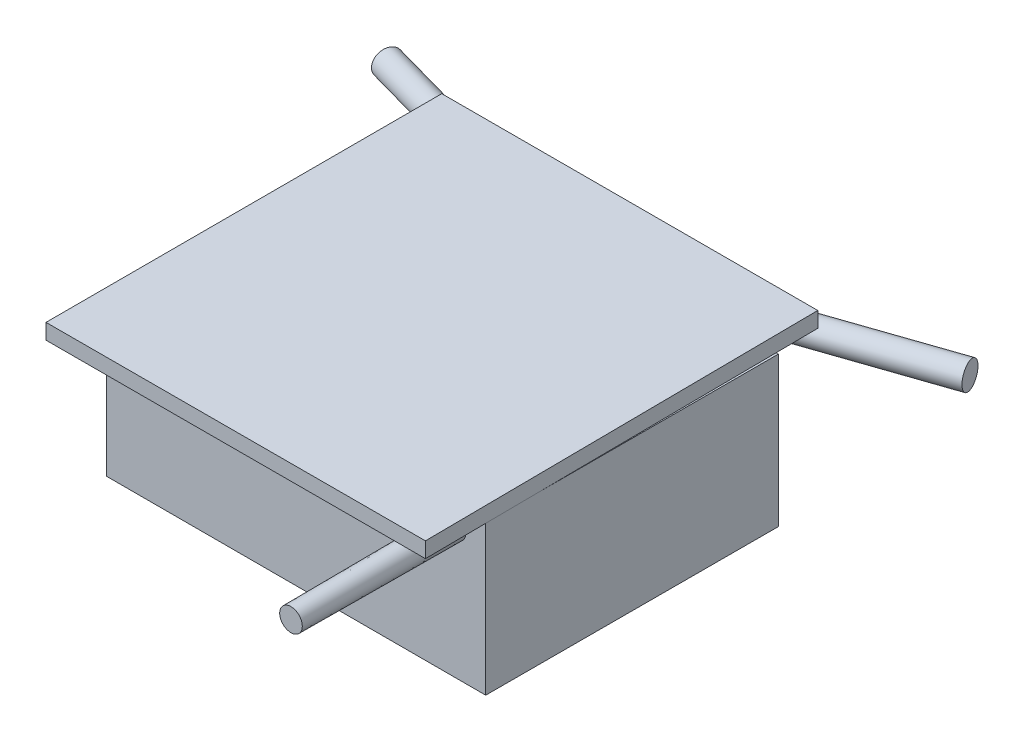
ISO-10303-21;
HEADER;
FILE_DESCRIPTION(('STEP AP214'),'2;1');
FILE_NAME('part.step','',(''),(''),'','','');
FILE_SCHEMA(('AUTOMOTIVE_DESIGN { 1 0 10303 214 1 1 1 1 }'));
ENDSEC;
DATA;
#1=APPLICATION_CONTEXT('core data for automotive mechanical design processes');
#2=APPLICATION_PROTOCOL_DEFINITION('international standard','automotive_design',2000,#1);
#3=PRODUCT_CONTEXT('',#1,'mechanical');
#4=PRODUCT('Part','Part','',(#3));
#5=PRODUCT_RELATED_PRODUCT_CATEGORY('part','',(#4));
#6=PRODUCT_DEFINITION_FORMATION('','',#4);
#7=PRODUCT_DEFINITION_CONTEXT('part definition',#1,'design');
#8=PRODUCT_DEFINITION('design','',#6,#7);
#9=PRODUCT_DEFINITION_SHAPE('','',#8);
#10=(LENGTH_UNIT() NAMED_UNIT(*) SI_UNIT(.MILLI.,.METRE.));
#11=(NAMED_UNIT(*) PLANE_ANGLE_UNIT() SI_UNIT($,.RADIAN.));
#12=(NAMED_UNIT(*) SI_UNIT($,.STERADIAN.) SOLID_ANGLE_UNIT());
#13=UNCERTAINTY_MEASURE_WITH_UNIT(LENGTH_MEASURE(1.E-05),#10,'distance_accuracy_value','');
#14=(GEOMETRIC_REPRESENTATION_CONTEXT(3) GLOBAL_UNCERTAINTY_ASSIGNED_CONTEXT((#13)) GLOBAL_UNIT_ASSIGNED_CONTEXT((#10,
#11,#12)) REPRESENTATION_CONTEXT('',''));
#15=CARTESIAN_POINT('',(0.,0.,0.));
#16=DIRECTION('',(0.,0.,1.));
#17=DIRECTION('',(1.,0.,0.));
#18=AXIS2_PLACEMENT_3D('',#15,#16,#17);
#19=CARTESIAN_POINT('',(368.6,320.,-303.3));
#20=DIRECTION('',(-0.999999440697741,0.,-0.00105764086800384));
#21=DIRECTION('',(-0.00105764086800384,0.,0.999999440697741));
#22=AXIS2_PLACEMENT_3D('',#19,#20,#21);
#23=PLANE('',#22);
#24=DIRECTION('',(0.,-1.,0.));
#25=VECTOR('',#24,1.);
#26=CARTESIAN_POINT('',(368.6,320.,-303.3));
#27=LINE('',#26,#25);
#28=CARTESIAN_POINT('',(368.6,290.,-303.3));
#29=VERTEX_POINT('',#28);
#30=CARTESIAN_POINT('',(368.6,0.,-303.3));
#31=VERTEX_POINT('',#30);
#32=EDGE_CURVE('E152',#29,#31,#27,.T.);
#33=ORIENTED_EDGE('',*,*,#32,.F.);
#34=DIRECTION('',(0.00105764086802147,0.,-0.999999440697741));
#35=VECTOR('',#34,1.);
#36=CARTESIAN_POINT('',(368.110287470613,290.,159.723196527804));
#37=LINE('',#36,#35);
#38=CARTESIAN_POINT('',(368.110287470613,290.,159.723196527804));
#39=VERTEX_POINT('',#38);
#40=EDGE_CURVE('E153',#39,#29,#37,.T.);
#41=ORIENTED_EDGE('',*,*,#40,.F.);
#42=DIRECTION('',(-0.00105764086800384,0.,0.999999440697741));
#43=VECTOR('',#42,1.);
#44=CARTESIAN_POINT('',(368.6,290.,-303.3));
#45=LINE('',#44,#43);
#46=CARTESIAN_POINT('',(368.,290.,264.));
#47=VERTEX_POINT('',#46);
#48=EDGE_CURVE('E186',#39,#47,#45,.T.);
#49=ORIENTED_EDGE('',*,*,#48,.T.);
#50=DIRECTION('',(0.,-1.,0.));
#51=VECTOR('',#50,1.);
#52=CARTESIAN_POINT('',(368.,320.,264.));
#53=LINE('',#52,#51);
#54=CARTESIAN_POINT('',(368.,0.,264.));
#55=VERTEX_POINT('',#54);
#56=EDGE_CURVE('E56',#47,#55,#53,.T.);
#57=ORIENTED_EDGE('',*,*,#56,.T.);
#58=DIRECTION('',(0.00105764086800384,0.,-0.999999440697741));
#59=VECTOR('',#58,1.);
#60=CARTESIAN_POINT('',(368.6,0.,-303.3));
#61=LINE('',#60,#59);
#62=EDGE_CURVE('E156',#55,#31,#61,.T.);
#63=ORIENTED_EDGE('',*,*,#62,.T.);
#64=EDGE_LOOP('',(#33,#41,#49,#57,#63));
#65=FACE_BOUND('',#64,.T.);
#66=ADVANCED_FACE('F37',(#65),#23,.F.);
#67=CARTESIAN_POINT('',(-367.,320.,-301.));
#68=DIRECTION('',(0.00312668400951165,0.,0.999995111911606));
#69=DIRECTION('',(0.999995111911606,0.,-0.00312668400951165));
#70=AXIS2_PLACEMENT_3D('',#67,#68,#69);
#71=PLANE('',#70);
#72=CARTESIAN_POINT('',(-7.60294097876668,254.,-302.123726530382));
#73=DIRECTION('',(0.00312668400951165,0.,0.999995111911606));
#74=DIRECTION('',(0.999995111911606,0.,-0.00312668400951165));
#75=AXIS2_PLACEMENT_3D('',#72,#73,#74);
#76=ELLIPSE('',#75,91.8978340216199,25.);
#77=CARTESIAN_POINT('',(-0.0622921836374691,278.915694866765,-302.147303871639));
#78=VERTEX_POINT('',#77);
#79=CARTESIAN_POINT('',(-0.0622921836374691,229.084305133235,-302.147303871639));
#80=VERTEX_POINT('',#79);
#81=EDGE_CURVE('E44',#78,#80,#76,.T.);
#82=ORIENTED_EDGE('',*,*,#81,.T.);
#83=CARTESIAN_POINT('',(6.3192653899421,254.,-302.167257083193));
#84=DIRECTION('',(0.00312668400951165,0.,0.999995111911606));
#85=DIRECTION('',(-0.999995111911606,0.,0.00312668400951165));
#86=AXIS2_PLACEMENT_3D('',#83,#84,#85);
#87=ELLIPSE('',#86,77.7719974274753,25.);
#88=EDGE_CURVE('E122',#80,#78,#87,.T.);
#89=ORIENTED_EDGE('',*,*,#88,.T.);
#90=EDGE_LOOP('',(#82,#89));
#91=FACE_BOUND('',#90,.T.);
#92=DIRECTION('',(0.999995111911606,0.,-0.00312668400951165));
#93=VECTOR('',#92,1.);
#94=CARTESIAN_POINT('',(-367.,290.,-301.));
#95=LINE('',#94,#93);
#96=CARTESIAN_POINT('',(-365.767405538303,290.,-301.003853952232));
#97=VERTEX_POINT('',#96);
#98=CARTESIAN_POINT('',(364.191588013752,290.,-303.286216221359));
#99=VERTEX_POINT('',#98);
#100=EDGE_CURVE('E190',#97,#99,#95,.T.);
#101=ORIENTED_EDGE('',*,*,#100,.T.);
#102=DIRECTION('',(-0.999995111911606,0.,0.0031266840095149));
#103=VECTOR('',#102,1.);
#104=CARTESIAN_POINT('',(368.6,290.,-303.3));
#105=LINE('',#104,#103);
#106=EDGE_CURVE('E269',#29,#99,#105,.T.);
#107=ORIENTED_EDGE('',*,*,#106,.F.);
#108=ORIENTED_EDGE('',*,*,#32,.T.);
#109=DIRECTION('',(-0.999995111911606,0.,0.00312668400951165));
#110=VECTOR('',#109,1.);
#111=CARTESIAN_POINT('',(-367.,0.,-301.));
#112=LINE('',#111,#110);
#113=CARTESIAN_POINT('',(-367.,0.,-301.));
#114=VERTEX_POINT('',#113);
#115=EDGE_CURVE('E201',#31,#114,#112,.T.);
#116=ORIENTED_EDGE('',*,*,#115,.T.);
#117=DIRECTION('',(0.,-1.,0.));
#118=VECTOR('',#117,1.);
#119=CARTESIAN_POINT('',(-367.,320.,-301.));
#120=LINE('',#119,#118);
#121=CARTESIAN_POINT('',(-367.,290.,-301.));
#122=VERTEX_POINT('',#121);
#123=EDGE_CURVE('E161',#122,#114,#120,.T.);
#124=ORIENTED_EDGE('',*,*,#123,.F.);
#125=DIRECTION('',(-0.999995111911606,0.,0.00312668400951849));
#126=VECTOR('',#125,1.);
#127=CARTESIAN_POINT('',(-365.767405538303,290.,-301.003853952232));
#128=LINE('',#127,#126);
#129=EDGE_CURVE('E216',#97,#122,#128,.T.);
#130=ORIENTED_EDGE('',*,*,#129,.F.);
#131=EDGE_LOOP('',(#101,#107,#108,#116,#124,#130));
#132=FACE_BOUND('',#131,.T.);
#133=ADVANCED_FACE('F123',(#91,#132),#71,.F.);
#134=CARTESIAN_POINT('',(-367.,320.,-301.));
#135=DIRECTION('',(0.999998433710313,0.,0.00176990873223064));
#136=DIRECTION('',(0.00176990873223064,0.,-0.999998433710313));
#137=AXIS2_PLACEMENT_3D('',#134,#135,#136);
#138=PLANE('',#137);
#139=DIRECTION('',(0.,-1.,0.));
#140=VECTOR('',#139,1.);
#141=CARTESIAN_POINT('',(-368.,320.,264.));
#142=LINE('',#141,#140);
#143=CARTESIAN_POINT('',(-368.,290.,264.));
#144=VERTEX_POINT('',#143);
#145=CARTESIAN_POINT('',(-368.,0.,264.));
#146=VERTEX_POINT('',#145);
#147=EDGE_CURVE('E165',#144,#146,#142,.T.);
#148=ORIENTED_EDGE('',*,*,#147,.F.);
#149=DIRECTION('',(-0.00176990873223064,0.,0.999998433710313));
#150=VECTOR('',#149,1.);
#151=CARTESIAN_POINT('',(-367.,290.,-301.));
#152=LINE('',#151,#150);
#153=EDGE_CURVE('E219',#122,#144,#152,.T.);
#154=ORIENTED_EDGE('',*,*,#153,.F.);
#155=ORIENTED_EDGE('',*,*,#123,.T.);
#156=DIRECTION('',(-0.00176990873223064,0.,0.999998433710313));
#157=VECTOR('',#156,1.);
#158=CARTESIAN_POINT('',(-367.,0.,-301.));
#159=LINE('',#158,#157);
#160=EDGE_CURVE('E203',#114,#146,#159,.T.);
#161=ORIENTED_EDGE('',*,*,#160,.T.);
#162=EDGE_LOOP('',(#148,#154,#155,#161));
#163=FACE_BOUND('',#162,.T.);
#164=ADVANCED_FACE('F149',(#163),#138,.F.);
#165=CARTESIAN_POINT('',(368.,320.,264.));
#166=DIRECTION('',(0.,0.,-1.));
#167=DIRECTION('',(-1.,0.,0.));
#168=AXIS2_PLACEMENT_3D('',#165,#166,#167);
#169=PLANE('',#168);
#170=CARTESIAN_POINT('',(306.,254.,264.));
#171=DIRECTION('',(0.,0.,-1.));
#172=DIRECTION('',(-1.,0.,0.));
#173=AXIS2_PLACEMENT_3D('',#170,#171,#172);
#174=CIRCLE('',#173,23.6176866000952);
#175=CARTESIAN_POINT('',(282.382313399905,254.,264.));
#176=VERTEX_POINT('',#175);
#177=EDGE_CURVE('E121',#176,#176,#174,.F.);
#178=ORIENTED_EDGE('',*,*,#177,.F.);
#179=EDGE_LOOP('',(#178));
#180=FACE_BOUND('',#179,.T.);
#181=DIRECTION('',(-1.,0.,0.));
#182=VECTOR('',#181,1.);
#183=CARTESIAN_POINT('',(368.,290.,264.));
#184=LINE('',#183,#182);
#185=CARTESIAN_POINT('',(-365.546844502277,290.,264.));
#186=VERTEX_POINT('',#185);
#187=EDGE_CURVE('E160',#47,#186,#184,.T.);
#188=ORIENTED_EDGE('',*,*,#187,.T.);
#189=DIRECTION('',(1.,0.,0.));
#190=VECTOR('',#189,1.);
#191=CARTESIAN_POINT('',(-368.,290.,264.));
#192=LINE('',#191,#190);
#193=EDGE_CURVE('E181',#144,#186,#192,.T.);
#194=ORIENTED_EDGE('',*,*,#193,.F.);
#195=ORIENTED_EDGE('',*,*,#147,.T.);
#196=DIRECTION('',(1.,0.,0.));
#197=VECTOR('',#196,1.);
#198=CARTESIAN_POINT('',(368.,0.,264.));
#199=LINE('',#198,#197);
#200=EDGE_CURVE('E206',#146,#55,#199,.T.);
#201=ORIENTED_EDGE('',*,*,#200,.T.);
#202=ORIENTED_EDGE('',*,*,#56,.F.);
#203=EDGE_LOOP('',(#188,#194,#195,#201,#202));
#204=FACE_BOUND('',#203,.T.);
#205=ADVANCED_FACE('F174',(#180,#204),#169,.F.);
#206=CARTESIAN_POINT('',(0.,320.,0.));
#207=DIRECTION('',(0.,-1.,0.));
#208=DIRECTION('',(0.,0.,-1.));
#209=AXIS2_PLACEMENT_3D('',#206,#207,#208);
#210=PLANE('',#209);
#211=DIRECTION('',(0.00846323855469968,0.,0.999964186155267));
#212=VECTOR('',#211,1.);
#213=CARTESIAN_POINT('',(363.5,320.,-385.));
#214=LINE('',#213,#212);
#215=CARTESIAN_POINT('',(363.5,320.,-385.));
#216=VERTEX_POINT('',#215);
#217=CARTESIAN_POINT('',(370.,320.,383.));
#218=VERTEX_POINT('',#217);
#219=EDGE_CURVE('E245',#216,#218,#214,.T.);
#220=ORIENTED_EDGE('',*,*,#219,.F.);
#221=DIRECTION('',(0.999999764983999,0.,-0.000685588759758748));
#222=VECTOR('',#221,1.);
#223=CARTESIAN_POINT('',(-365.8,320.,-384.5));
#224=LINE('',#223,#222);
#225=CARTESIAN_POINT('',(-365.8,320.,-384.5));
#226=VERTEX_POINT('',#225);
#227=EDGE_CURVE('E242',#226,#216,#224,.T.);
#228=ORIENTED_EDGE('',*,*,#227,.F.);
#229=DIRECTION('',(0.000390370822565609,0.,0.999999923805308));
#230=VECTOR('',#229,1.);
#231=CARTESIAN_POINT('',(-365.8,320.,-384.5));
#232=LINE('',#231,#230);
#233=CARTESIAN_POINT('',(-365.5,320.,384.));
#234=VERTEX_POINT('',#233);
#235=EDGE_CURVE('E250',#226,#234,#232,.T.);
#236=ORIENTED_EDGE('',*,*,#235,.T.);
#237=DIRECTION('',(0.999999075718952,0.,-0.00135961804992387));
#238=VECTOR('',#237,1.);
#239=CARTESIAN_POINT('',(-365.5,320.,384.));
#240=LINE('',#239,#238);
#241=EDGE_CURVE('E247',#234,#218,#240,.T.);
#242=ORIENTED_EDGE('',*,*,#241,.T.);
#243=EDGE_LOOP('',(#220,#228,#236,#242));
#244=FACE_BOUND('',#243,.T.);
#245=ADVANCED_FACE('F177',(#244),#210,.F.);
#246=CARTESIAN_POINT('',(0.,0.,0.));
#247=DIRECTION('',(0.,-1.,0.));
#248=DIRECTION('',(0.,0.,-1.));
#249=AXIS2_PLACEMENT_3D('',#246,#247,#248);
#250=PLANE('',#249);
#251=ORIENTED_EDGE('',*,*,#62,.F.);
#252=ORIENTED_EDGE('',*,*,#200,.F.);
#253=ORIENTED_EDGE('',*,*,#160,.F.);
#254=ORIENTED_EDGE('',*,*,#115,.F.);
#255=EDGE_LOOP('',(#251,#252,#253,#254));
#256=FACE_BOUND('',#255,.T.);
#257=ADVANCED_FACE('F214',(#256),#250,.T.);
#258=CARTESIAN_POINT('',(-365.5,290.,384.));
#259=DIRECTION('',(0.00135961804992387,0.,0.999999075718952));
#260=DIRECTION('',(0.999999075718952,0.,-0.00135961804992387));
#261=AXIS2_PLACEMENT_3D('',#258,#259,#260);
#262=PLANE('',#261);
#263=ORIENTED_EDGE('',*,*,#241,.F.);
#264=DIRECTION('',(0.,1.,0.));
#265=VECTOR('',#264,1.);
#266=CARTESIAN_POINT('',(-365.5,290.,384.));
#267=LINE('',#266,#265);
#268=CARTESIAN_POINT('',(-365.5,290.,384.));
#269=VERTEX_POINT('',#268);
#270=EDGE_CURVE('E236',#269,#234,#267,.T.);
#271=ORIENTED_EDGE('',*,*,#270,.F.);
#272=DIRECTION('',(0.999999075718952,0.,-0.00135961804992387));
#273=VECTOR('',#272,1.);
#274=CARTESIAN_POINT('',(-365.5,290.,384.));
#275=LINE('',#274,#273);
#276=CARTESIAN_POINT('',(370.,290.,383.));
#277=VERTEX_POINT('',#276);
#278=EDGE_CURVE('E238',#269,#277,#275,.T.);
#279=ORIENTED_EDGE('',*,*,#278,.T.);
#280=DIRECTION('',(0.,1.,0.));
#281=VECTOR('',#280,1.);
#282=CARTESIAN_POINT('',(370.,290.,383.));
#283=LINE('',#282,#281);
#284=EDGE_CURVE('E196',#277,#218,#283,.T.);
#285=ORIENTED_EDGE('',*,*,#284,.T.);
#286=EDGE_LOOP('',(#263,#271,#279,#285));
#287=FACE_BOUND('',#286,.T.);
#288=ADVANCED_FACE('F259',(#287),#262,.T.);
#289=CARTESIAN_POINT('',(0.,290.,0.));
#290=DIRECTION('',(0.,-1.,0.));
#291=DIRECTION('',(0.,0.,-1.));
#292=AXIS2_PLACEMENT_3D('',#289,#290,#291);
#293=PLANE('',#292);
#294=ORIENTED_EDGE('',*,*,#48,.F.);
#295=DIRECTION('',(0.00846323855469968,0.,0.999964186155267));
#296=VECTOR('',#295,1.);
#297=CARTESIAN_POINT('',(363.5,290.,-385.));
#298=LINE('',#297,#296);
#299=EDGE_CURVE('E264',#39,#277,#298,.T.);
#300=ORIENTED_EDGE('',*,*,#299,.T.);
#301=ORIENTED_EDGE('',*,*,#278,.F.);
#302=DIRECTION('',(0.000390370822565609,0.,0.999999923805308));
#303=VECTOR('',#302,1.);
#304=CARTESIAN_POINT('',(-365.8,290.,-384.5));
#305=LINE('',#304,#303);
#306=EDGE_CURVE('E189',#186,#269,#305,.T.);
#307=ORIENTED_EDGE('',*,*,#306,.F.);
#308=ORIENTED_EDGE('',*,*,#187,.F.);
#309=EDGE_LOOP('',(#294,#300,#301,#307,#308));
#310=FACE_BOUND('',#309,.T.);
#311=ADVANCED_FACE('F185',(#310),#293,.T.);
#312=CARTESIAN_POINT('',(363.5,290.,-385.));
#313=DIRECTION('',(-0.999964186155267,0.,0.00846323855469968));
#314=DIRECTION('',(0.00846323855469968,0.,0.999964186155267));
#315=AXIS2_PLACEMENT_3D('',#312,#313,#314);
#316=PLANE('',#315);
#317=ORIENTED_EDGE('',*,*,#299,.F.);
#318=DIRECTION('',(0.00846323855469966,0.,0.999964186155267));
#319=VECTOR('',#318,1.);
#320=CARTESIAN_POINT('',(364.191588013752,290.,-303.286216221359));
#321=LINE('',#320,#319);
#322=EDGE_CURVE('E272',#99,#39,#321,.T.);
#323=ORIENTED_EDGE('',*,*,#322,.F.);
#324=CARTESIAN_POINT('',(363.5,290.,-385.));
#325=VERTEX_POINT('',#324);
#326=EDGE_CURVE('E229',#325,#99,#298,.T.);
#327=ORIENTED_EDGE('',*,*,#326,.F.);
#328=DIRECTION('',(0.,1.,0.));
#329=VECTOR('',#328,1.);
#330=CARTESIAN_POINT('',(363.5,290.,-385.));
#331=LINE('',#330,#329);
#332=EDGE_CURVE('E191',#325,#216,#331,.T.);
#333=ORIENTED_EDGE('',*,*,#332,.T.);
#334=ORIENTED_EDGE('',*,*,#219,.T.);
#335=ORIENTED_EDGE('',*,*,#284,.F.);
#336=EDGE_LOOP('',(#317,#323,#327,#333,#334,#335));
#337=FACE_BOUND('',#336,.T.);
#338=ADVANCED_FACE('F304',(#337),#316,.F.);
#339=ORIENTED_EDGE('',*,*,#100,.F.);
#340=CARTESIAN_POINT('',(-365.8,290.,-384.5));
#341=VERTEX_POINT('',#340);
#342=EDGE_CURVE('E228',#341,#97,#305,.T.);
#343=ORIENTED_EDGE('',*,*,#342,.F.);
#344=DIRECTION('',(0.999999764983999,0.,-0.000685588759758748));
#345=VECTOR('',#344,1.);
#346=CARTESIAN_POINT('',(-365.8,290.,-384.5));
#347=LINE('',#346,#345);
#348=EDGE_CURVE('E251',#341,#325,#347,.T.);
#349=ORIENTED_EDGE('',*,*,#348,.T.);
#350=ORIENTED_EDGE('',*,*,#326,.T.);
#351=EDGE_LOOP('',(#339,#343,#349,#350));
#352=FACE_BOUND('',#351,.T.);
#353=ADVANCED_FACE('F226',(#352),#293,.T.);
#354=CARTESIAN_POINT('',(-365.8,290.,-384.5));
#355=DIRECTION('',(-0.999999923805308,0.,0.000390370822565609));
#356=DIRECTION('',(0.000390370822565609,0.,0.999999923805308));
#357=AXIS2_PLACEMENT_3D('',#354,#355,#356);
#358=PLANE('',#357);
#359=ORIENTED_EDGE('',*,*,#342,.T.);
#360=DIRECTION('',(-0.000390370822565578,0.,-0.999999923805308));
#361=VECTOR('',#360,1.);
#362=CARTESIAN_POINT('',(-365.767405538303,290.,-301.003853952232));
#363=LINE('',#362,#361);
#364=EDGE_CURVE('E220',#186,#97,#363,.T.);
#365=ORIENTED_EDGE('',*,*,#364,.F.);
#366=ORIENTED_EDGE('',*,*,#306,.T.);
#367=ORIENTED_EDGE('',*,*,#270,.T.);
#368=ORIENTED_EDGE('',*,*,#235,.F.);
#369=DIRECTION('',(0.,1.,0.));
#370=VECTOR('',#369,1.);
#371=CARTESIAN_POINT('',(-365.8,290.,-384.5));
#372=LINE('',#371,#370);
#373=EDGE_CURVE('E233',#341,#226,#372,.T.);
#374=ORIENTED_EDGE('',*,*,#373,.F.);
#375=EDGE_LOOP('',(#359,#365,#366,#367,#368,#374));
#376=FACE_BOUND('',#375,.T.);
#377=ADVANCED_FACE('F231',(#376),#358,.T.);
#378=CARTESIAN_POINT('',(-365.8,290.,-384.5));
#379=DIRECTION('',(0.000685588759758748,0.,0.999999764983999));
#380=DIRECTION('',(0.999999764983999,0.,-0.000685588759758748));
#381=AXIS2_PLACEMENT_3D('',#378,#379,#380);
#382=PLANE('',#381);
#383=ORIENTED_EDGE('',*,*,#227,.T.);
#384=ORIENTED_EDGE('',*,*,#332,.F.);
#385=ORIENTED_EDGE('',*,*,#348,.F.);
#386=ORIENTED_EDGE('',*,*,#373,.T.);
#387=EDGE_LOOP('',(#383,#384,#385,#386));
#388=FACE_BOUND('',#387,.T.);
#389=ADVANCED_FACE('F301',(#388),#382,.F.);
#390=CARTESIAN_POINT('',(0.,290.,0.));
#391=DIRECTION('',(0.,-1.,0.));
#392=DIRECTION('',(0.,0.,-1.));
#393=AXIS2_PLACEMENT_3D('',#390,#391,#392);
#394=PLANE('',#393);
#395=ORIENTED_EDGE('',*,*,#153,.T.);
#396=ORIENTED_EDGE('',*,*,#193,.T.);
#397=ORIENTED_EDGE('',*,*,#364,.T.);
#398=ORIENTED_EDGE('',*,*,#129,.T.);
#399=EDGE_LOOP('',(#395,#396,#397,#398));
#400=FACE_BOUND('',#399,.T.);
#401=ADVANCED_FACE('F297',(#400),#394,.F.);
#402=CARTESIAN_POINT('',(0.,290.,0.));
#403=DIRECTION('',(0.,-1.,0.));
#404=DIRECTION('',(0.,0.,-1.));
#405=AXIS2_PLACEMENT_3D('',#402,#403,#404);
#406=PLANE('',#405);
#407=ORIENTED_EDGE('',*,*,#40,.T.);
#408=ORIENTED_EDGE('',*,*,#106,.T.);
#409=ORIENTED_EDGE('',*,*,#322,.T.);
#410=EDGE_LOOP('',(#407,#408,#409));
#411=FACE_BOUND('',#410,.T.);
#412=ADVANCED_FACE('F293',(#411),#406,.F.);
#413=CARTESIAN_POINT('',(306.,254.,0.));
#414=DIRECTION('',(0.,0.,-1.));
#415=DIRECTION('',(1.,0.,0.));
#416=AXIS2_PLACEMENT_3D('',#413,#414,#415);
#417=CONICAL_SURFACE('',#416,25.,0.005235987755983);
#418=CARTESIAN_POINT('',(306.,254.,580.));
#419=DIRECTION('',(0.,0.,1.));
#420=DIRECTION('',(1.,0.,0.));
#421=AXIS2_PLACEMENT_3D('',#418,#419,#420);
#422=CIRCLE('',#421,21.9630993486939);
#423=CARTESIAN_POINT('',(327.963099348694,254.,580.));
#424=VERTEX_POINT('',#423);
#425=EDGE_CURVE('E271',#424,#424,#422,.T.);
#426=ORIENTED_EDGE('',*,*,#425,.F.);
#427=EDGE_LOOP('',(#426));
#428=FACE_BOUND('',#427,.T.);
#429=ORIENTED_EDGE('',*,*,#177,.T.);
#430=EDGE_LOOP('',(#429));
#431=FACE_BOUND('',#430,.T.);
#432=ADVANCED_FACE('F172',(#428,#431),#417,.T.);
#433=CARTESIAN_POINT('',(306.,254.,580.));
#434=DIRECTION('',(0.,0.,1.));
#435=DIRECTION('',(1.,0.,0.));
#436=AXIS2_PLACEMENT_3D('',#433,#434,#435);
#437=PLANE('',#436);
#438=ORIENTED_EDGE('',*,*,#425,.T.);
#439=EDGE_LOOP('',(#438));
#440=FACE_BOUND('',#439,.T.);
#441=ADVANCED_FACE('F283',(#440),#437,.T.);
#442=CARTESIAN_POINT('',(-537.,254.,-450.));
#443=DIRECTION('',(0.963131479096422,0.,0.269031139412408));
#444=DIRECTION('',(0.269031139412408,0.,-0.963131479096422));
#445=AXIS2_PLACEMENT_3D('',#442,#443,#444);
#446=CYLINDRICAL_SURFACE('',#445,25.);
#447=CARTESIAN_POINT('',(3.88578058618805E-13,254.,-300.));
#448=DIRECTION('',(0.999579490225005,0.,-0.0289972881752447));
#449=DIRECTION('',(0.0289972881752448,0.,0.999579490225006));
#450=AXIS2_PLACEMENT_3D('',#447,#448,#449);
#451=ELLIPSE('',#450,26.1800582885988,25.);
#452=EDGE_CURVE('E11',#80,#78,#451,.T.);
#453=ORIENTED_EDGE('',*,*,#452,.F.);
#454=ORIENTED_EDGE('',*,*,#81,.F.);
#455=EDGE_LOOP('',(#453,#454));
#456=FACE_BOUND('',#455,.T.);
#457=CARTESIAN_POINT('',(-537.,254.,-450.));
#458=DIRECTION('',(0.963131479096422,0.,0.269031139412408));
#459=DIRECTION('',(0.269031139412408,0.,-0.963131479096422));
#460=AXIS2_PLACEMENT_3D('',#457,#458,#459);
#461=CIRCLE('',#460,25.);
#462=CARTESIAN_POINT('',(-530.27422151469,254.,-474.078286977411));
#463=VERTEX_POINT('',#462);
#464=EDGE_CURVE('E126',#463,#463,#461,.T.);
#465=ORIENTED_EDGE('',*,*,#464,.T.);
#466=EDGE_LOOP('',(#465));
#467=FACE_BOUND('',#466,.T.);
#468=ADVANCED_FACE('F117',(#456,#467),#446,.T.);
#469=CARTESIAN_POINT('',(-537.,254.,-450.));
#470=DIRECTION('',(0.963131479096422,0.,0.269031139412408));
#471=DIRECTION('',(0.269031139412408,0.,-0.963131479096422));
#472=AXIS2_PLACEMENT_3D('',#469,#470,#471);
#473=PLANE('',#472);
#474=ORIENTED_EDGE('',*,*,#464,.F.);
#475=EDGE_LOOP('',(#474));
#476=FACE_BOUND('',#475,.T.);
#477=ADVANCED_FACE('F132',(#476),#473,.F.);
#478=CARTESIAN_POINT('',(554.,254.,-490.));
#479=DIRECTION('',(-0.945916008892391,0.,0.324411627598473));
#480=DIRECTION('',(0.324411627598473,0.,0.945916008892391));
#481=AXIS2_PLACEMENT_3D('',#478,#479,#480);
#482=CYLINDRICAL_SURFACE('',#481,25.);
#483=CARTESIAN_POINT('',(554.,254.,-490.));
#484=DIRECTION('',(-0.945916008892391,0.,0.324411627598473));
#485=DIRECTION('',(0.324411627598473,0.,0.945916008892391));
#486=AXIS2_PLACEMENT_3D('',#483,#484,#485);
#487=CIRCLE('',#486,25.);
#488=CARTESIAN_POINT('',(562.110290689962,254.,-466.35209977769));
#489=VERTEX_POINT('',#488);
#490=EDGE_CURVE('E127',#489,#489,#487,.T.);
#491=ORIENTED_EDGE('',*,*,#490,.T.);
#492=EDGE_LOOP('',(#491));
#493=FACE_BOUND('',#492,.T.);
#494=ORIENTED_EDGE('',*,*,#88,.F.);
#495=ORIENTED_EDGE('',*,*,#452,.T.);
#496=EDGE_LOOP('',(#494,#495));
#497=FACE_BOUND('',#496,.T.);
#498=ADVANCED_FACE('F129',(#493,#497),#482,.T.);
#499=CARTESIAN_POINT('',(554.,254.,-490.));
#500=DIRECTION('',(-0.945916008892391,0.,0.324411627598473));
#501=DIRECTION('',(0.324411627598473,0.,0.945916008892391));
#502=AXIS2_PLACEMENT_3D('',#499,#500,#501);
#503=PLANE('',#502);
#504=ORIENTED_EDGE('',*,*,#490,.F.);
#505=EDGE_LOOP('',(#504));
#506=FACE_BOUND('',#505,.T.);
#507=ADVANCED_FACE('F131',(#506),#503,.F.);
#508=CLOSED_SHELL('',(#66,#133,#164,#205,#245,#257,#288,#311,#338,#353,#377,#389,#401,#412,#432,
#441,#468,#477,#498,#507));
#509=MANIFOLD_SOLID_BREP('B2',#508);
#510=ADVANCED_BREP_SHAPE_REPRESENTATION('',(#18,#509),#14);
#511=SHAPE_DEFINITION_REPRESENTATION(#9,#510);
ENDSEC;
END-ISO-10303-21;
